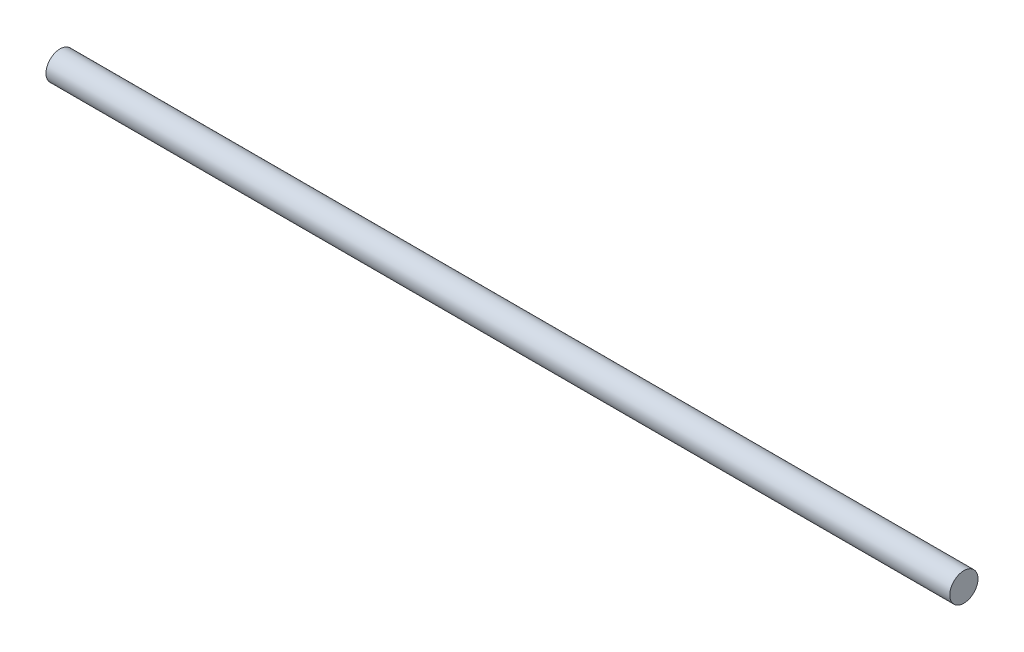
ISO-10303-21;
HEADER;
FILE_DESCRIPTION(('STEP AP214'),'2;1');
FILE_NAME('part.step','',(''),(''),'','','');
FILE_SCHEMA(('AUTOMOTIVE_DESIGN { 1 0 10303 214 1 1 1 1 }'));
ENDSEC;
DATA;
#1=APPLICATION_CONTEXT('core data for automotive mechanical design processes');
#2=APPLICATION_PROTOCOL_DEFINITION('international standard','automotive_design',2000,#1);
#3=PRODUCT_CONTEXT('',#1,'mechanical');
#4=PRODUCT('Part','Part','',(#3));
#5=PRODUCT_RELATED_PRODUCT_CATEGORY('part','',(#4));
#6=PRODUCT_DEFINITION_FORMATION('','',#4);
#7=PRODUCT_DEFINITION_CONTEXT('part definition',#1,'design');
#8=PRODUCT_DEFINITION('design','',#6,#7);
#9=PRODUCT_DEFINITION_SHAPE('','',#8);
#10=(LENGTH_UNIT() NAMED_UNIT(*) SI_UNIT(.MILLI.,.METRE.));
#11=(NAMED_UNIT(*) PLANE_ANGLE_UNIT() SI_UNIT($,.RADIAN.));
#12=(NAMED_UNIT(*) SI_UNIT($,.STERADIAN.) SOLID_ANGLE_UNIT());
#13=UNCERTAINTY_MEASURE_WITH_UNIT(LENGTH_MEASURE(1.E-05),#10,'distance_accuracy_value','');
#14=(GEOMETRIC_REPRESENTATION_CONTEXT(3) GLOBAL_UNCERTAINTY_ASSIGNED_CONTEXT((#13)) GLOBAL_UNIT_ASSIGNED_CONTEXT((#10,
#11,#12)) REPRESENTATION_CONTEXT('',''));
#15=CARTESIAN_POINT('',(0.,0.,0.));
#16=DIRECTION('',(0.,0.,1.));
#17=DIRECTION('',(1.,0.,0.));
#18=AXIS2_PLACEMENT_3D('',#15,#16,#17);
#19=CARTESIAN_POINT('',(80.,0.,0.));
#20=DIRECTION('',(-1.,0.,0.));
#21=DIRECTION('',(0.,0.,1.));
#22=AXIS2_PLACEMENT_3D('',#19,#20,#21);
#23=CYLINDRICAL_SURFACE('',#22,1.25);
#24=CARTESIAN_POINT('',(80.,0.,0.));
#25=DIRECTION('',(1.,0.,0.));
#26=DIRECTION('',(0.,0.,-1.));
#27=AXIS2_PLACEMENT_3D('',#24,#25,#26);
#28=CIRCLE('',#27,1.25);
#29=CARTESIAN_POINT('',(80.,0.,-1.25));
#30=VERTEX_POINT('',#29);
#31=EDGE_CURVE('E10',#30,#30,#28,.T.);
#32=ORIENTED_EDGE('',*,*,#31,.F.);
#33=EDGE_LOOP('',(#32));
#34=FACE_BOUND('',#33,.T.);
#35=CARTESIAN_POINT('',(0.,0.,0.));
#36=DIRECTION('',(1.,0.,0.));
#37=DIRECTION('',(0.,0.,-1.));
#38=AXIS2_PLACEMENT_3D('',#35,#36,#37);
#39=CIRCLE('',#38,1.25);
#40=CARTESIAN_POINT('',(0.,0.,-1.25));
#41=VERTEX_POINT('',#40);
#42=EDGE_CURVE('E40',#41,#41,#39,.T.);
#43=ORIENTED_EDGE('',*,*,#42,.T.);
#44=EDGE_LOOP('',(#43));
#45=FACE_BOUND('',#44,.T.);
#46=ADVANCED_FACE('F37',(#34,#45),#23,.T.);
#47=CARTESIAN_POINT('',(80.,0.,0.));
#48=DIRECTION('',(1.,0.,0.));
#49=DIRECTION('',(0.,0.,-1.));
#50=AXIS2_PLACEMENT_3D('',#47,#48,#49);
#51=PLANE('',#50);
#52=ORIENTED_EDGE('',*,*,#31,.T.);
#53=EDGE_LOOP('',(#52));
#54=FACE_BOUND('',#53,.T.);
#55=ADVANCED_FACE('F54',(#54),#51,.T.);
#56=CARTESIAN_POINT('',(0.,0.,0.));
#57=DIRECTION('',(1.,0.,0.));
#58=DIRECTION('',(0.,0.,-1.));
#59=AXIS2_PLACEMENT_3D('',#56,#57,#58);
#60=PLANE('',#59);
#61=ORIENTED_EDGE('',*,*,#42,.F.);
#62=EDGE_LOOP('',(#61));
#63=FACE_BOUND('',#62,.T.);
#64=ADVANCED_FACE('F52',(#63),#60,.F.);
#65=CLOSED_SHELL('',(#46,#55,#64));
#66=MANIFOLD_SOLID_BREP('B2',#65);
#67=ADVANCED_BREP_SHAPE_REPRESENTATION('',(#18,#66),#14);
#68=SHAPE_DEFINITION_REPRESENTATION(#9,#67);
ENDSEC;
END-ISO-10303-21;
